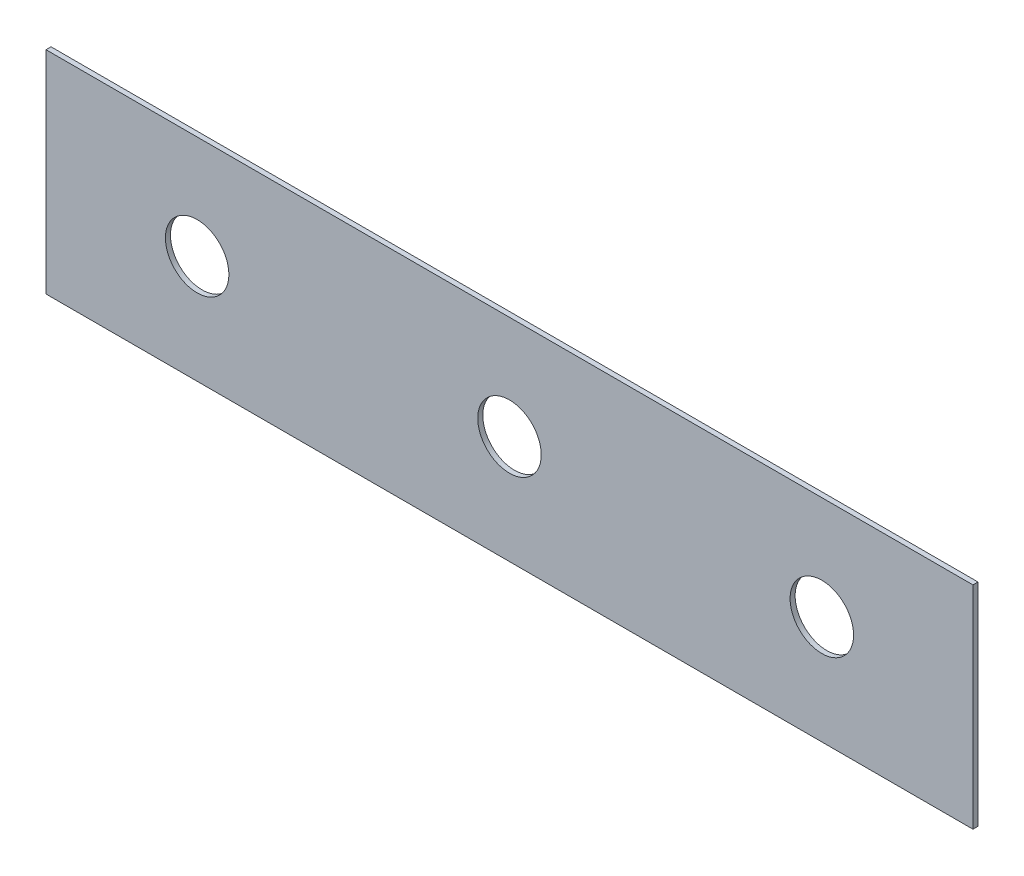
ISO-10303-21;
HEADER;
FILE_DESCRIPTION(('STEP AP214'),'2;1');
FILE_NAME('part.step','',(''),(''),'','','');
FILE_SCHEMA(('AUTOMOTIVE_DESIGN { 1 0 10303 214 1 1 1 1 }'));
ENDSEC;
DATA;
#1=APPLICATION_CONTEXT('core data for automotive mechanical design processes');
#2=APPLICATION_PROTOCOL_DEFINITION('international standard','automotive_design',2000,#1);
#3=PRODUCT_CONTEXT('',#1,'mechanical');
#4=PRODUCT('Part','Part','',(#3));
#5=PRODUCT_RELATED_PRODUCT_CATEGORY('part','',(#4));
#6=PRODUCT_DEFINITION_FORMATION('','',#4);
#7=PRODUCT_DEFINITION_CONTEXT('part definition',#1,'design');
#8=PRODUCT_DEFINITION('design','',#6,#7);
#9=PRODUCT_DEFINITION_SHAPE('','',#8);
#10=(LENGTH_UNIT() NAMED_UNIT(*) SI_UNIT(.MILLI.,.METRE.));
#11=(NAMED_UNIT(*) PLANE_ANGLE_UNIT() SI_UNIT($,.RADIAN.));
#12=(NAMED_UNIT(*) SI_UNIT($,.STERADIAN.) SOLID_ANGLE_UNIT());
#13=UNCERTAINTY_MEASURE_WITH_UNIT(LENGTH_MEASURE(1.E-05),#10,'distance_accuracy_value','');
#14=(GEOMETRIC_REPRESENTATION_CONTEXT(3) GLOBAL_UNCERTAINTY_ASSIGNED_CONTEXT((#13)) GLOBAL_UNIT_ASSIGNED_CONTEXT((#10,
#11,#12)) REPRESENTATION_CONTEXT('',''));
#15=CARTESIAN_POINT('',(0.,0.,0.));
#16=DIRECTION('',(0.,0.,1.));
#17=DIRECTION('',(1.,0.,0.));
#18=AXIS2_PLACEMENT_3D('',#15,#16,#17);
#19=CARTESIAN_POINT('',(0.,0.,1.));
#20=DIRECTION('',(0.,0.,1.));
#21=DIRECTION('',(1.,0.,0.));
#22=AXIS2_PLACEMENT_3D('',#19,#20,#21);
#23=PLANE('',#22);
#24=CARTESIAN_POINT('',(0.,28.5,1.));
#25=DIRECTION('',(0.,0.,1.));
#26=DIRECTION('',(1.,0.,0.));
#27=AXIS2_PLACEMENT_3D('',#24,#25,#26);
#28=CIRCLE('',#27,6.3);
#29=CARTESIAN_POINT('',(6.3,28.5,1.));
#30=VERTEX_POINT('',#29);
#31=EDGE_CURVE('E141',#30,#30,#28,.T.);
#32=ORIENTED_EDGE('',*,*,#31,.F.);
#33=EDGE_LOOP('',(#32));
#34=FACE_BOUND('',#33,.T.);
#35=DIRECTION('',(0.,-1.,0.));
#36=VECTOR('',#35,1.);
#37=CARTESIAN_POINT('',(-92.,49.,1.));
#38=LINE('',#37,#36);
#39=CARTESIAN_POINT('',(-92.,49.,1.));
#40=VERTEX_POINT('',#39);
#41=CARTESIAN_POINT('',(-92.,7.,1.));
#42=VERTEX_POINT('',#41);
#43=EDGE_CURVE('E98',#40,#42,#38,.T.);
#44=ORIENTED_EDGE('',*,*,#43,.T.);
#45=DIRECTION('',(1.,0.,0.));
#46=VECTOR('',#45,1.);
#47=CARTESIAN_POINT('',(-92.,7.,1.));
#48=LINE('',#47,#46);
#49=CARTESIAN_POINT('',(92.,7.,1.));
#50=VERTEX_POINT('',#49);
#51=EDGE_CURVE('E93',#42,#50,#48,.T.);
#52=ORIENTED_EDGE('',*,*,#51,.T.);
#53=DIRECTION('',(0.,1.,0.));
#54=VECTOR('',#53,1.);
#55=CARTESIAN_POINT('',(92.,7.,1.));
#56=LINE('',#55,#54);
#57=CARTESIAN_POINT('',(92.,49.,1.));
#58=VERTEX_POINT('',#57);
#59=EDGE_CURVE('E96',#50,#58,#56,.T.);
#60=ORIENTED_EDGE('',*,*,#59,.T.);
#61=DIRECTION('',(-1.,0.,0.));
#62=VECTOR('',#61,1.);
#63=CARTESIAN_POINT('',(92.,49.,1.));
#64=LINE('',#63,#62);
#65=EDGE_CURVE('E63',#58,#40,#64,.T.);
#66=ORIENTED_EDGE('',*,*,#65,.T.);
#67=EDGE_LOOP('',(#44,#52,#60,#66));
#68=FACE_BOUND('',#67,.T.);
#69=CARTESIAN_POINT('',(-62.,28.5,1.));
#70=DIRECTION('',(0.,0.,1.));
#71=DIRECTION('',(1.,0.,0.));
#72=AXIS2_PLACEMENT_3D('',#69,#70,#71);
#73=CIRCLE('',#72,6.3);
#74=CARTESIAN_POINT('',(-55.7,28.5,1.));
#75=VERTEX_POINT('',#74);
#76=EDGE_CURVE('E119',#75,#75,#73,.T.);
#77=ORIENTED_EDGE('',*,*,#76,.F.);
#78=EDGE_LOOP('',(#77));
#79=FACE_BOUND('',#78,.T.);
#80=CARTESIAN_POINT('',(62.,28.5,1.));
#81=DIRECTION('',(0.,0.,1.));
#82=DIRECTION('',(1.,0.,0.));
#83=AXIS2_PLACEMENT_3D('',#80,#81,#82);
#84=CIRCLE('',#83,6.3);
#85=CARTESIAN_POINT('',(68.3,28.5,1.));
#86=VERTEX_POINT('',#85);
#87=EDGE_CURVE('E149',#86,#86,#84,.T.);
#88=ORIENTED_EDGE('',*,*,#87,.F.);
#89=EDGE_LOOP('',(#88));
#90=FACE_BOUND('',#89,.T.);
#91=ADVANCED_FACE('F45',(#34,#68,#79,#90),#23,.T.);
#92=CARTESIAN_POINT('',(0.,0.,0.));
#93=DIRECTION('',(0.,0.,1.));
#94=DIRECTION('',(1.,0.,0.));
#95=AXIS2_PLACEMENT_3D('',#92,#93,#94);
#96=PLANE('',#95);
#97=DIRECTION('',(0.,-1.,0.));
#98=VECTOR('',#97,1.);
#99=CARTESIAN_POINT('',(-92.,49.,0.));
#100=LINE('',#99,#98);
#101=CARTESIAN_POINT('',(-92.,49.,0.));
#102=VERTEX_POINT('',#101);
#103=CARTESIAN_POINT('',(-92.,7.,0.));
#104=VERTEX_POINT('',#103);
#105=EDGE_CURVE('E115',#102,#104,#100,.T.);
#106=ORIENTED_EDGE('',*,*,#105,.F.);
#107=DIRECTION('',(-1.,0.,0.));
#108=VECTOR('',#107,1.);
#109=CARTESIAN_POINT('',(92.,49.,0.));
#110=LINE('',#109,#108);
#111=CARTESIAN_POINT('',(92.,49.,0.));
#112=VERTEX_POINT('',#111);
#113=EDGE_CURVE('E86',#112,#102,#110,.T.);
#114=ORIENTED_EDGE('',*,*,#113,.F.);
#115=DIRECTION('',(0.,1.,0.));
#116=VECTOR('',#115,1.);
#117=CARTESIAN_POINT('',(92.,7.,0.));
#118=LINE('',#117,#116);
#119=CARTESIAN_POINT('',(92.,7.,0.));
#120=VERTEX_POINT('',#119);
#121=EDGE_CURVE('E80',#120,#112,#118,.T.);
#122=ORIENTED_EDGE('',*,*,#121,.F.);
#123=DIRECTION('',(1.,0.,0.));
#124=VECTOR('',#123,1.);
#125=CARTESIAN_POINT('',(-92.,7.,0.));
#126=LINE('',#125,#124);
#127=EDGE_CURVE('E103',#104,#120,#126,.T.);
#128=ORIENTED_EDGE('',*,*,#127,.F.);
#129=EDGE_LOOP('',(#106,#114,#122,#128));
#130=FACE_BOUND('',#129,.T.);
#131=CARTESIAN_POINT('',(-62.,28.5,0.));
#132=DIRECTION('',(0.,0.,1.));
#133=DIRECTION('',(1.,0.,0.));
#134=AXIS2_PLACEMENT_3D('',#131,#132,#133);
#135=CIRCLE('',#134,6.3);
#136=CARTESIAN_POINT('',(-55.7,28.5,0.));
#137=VERTEX_POINT('',#136);
#138=EDGE_CURVE('E137',#137,#137,#135,.T.);
#139=ORIENTED_EDGE('',*,*,#138,.T.);
#140=EDGE_LOOP('',(#139));
#141=FACE_BOUND('',#140,.T.);
#142=CARTESIAN_POINT('',(0.,28.5,0.));
#143=DIRECTION('',(0.,0.,1.));
#144=DIRECTION('',(1.,0.,0.));
#145=AXIS2_PLACEMENT_3D('',#142,#143,#144);
#146=CIRCLE('',#145,6.3);
#147=CARTESIAN_POINT('',(6.3,28.5,0.));
#148=VERTEX_POINT('',#147);
#149=EDGE_CURVE('E145',#148,#148,#146,.T.);
#150=ORIENTED_EDGE('',*,*,#149,.T.);
#151=EDGE_LOOP('',(#150));
#152=FACE_BOUND('',#151,.T.);
#153=CARTESIAN_POINT('',(62.,28.5,0.));
#154=DIRECTION('',(0.,0.,1.));
#155=DIRECTION('',(1.,0.,0.));
#156=AXIS2_PLACEMENT_3D('',#153,#154,#155);
#157=CIRCLE('',#156,6.3);
#158=CARTESIAN_POINT('',(68.3,28.5,0.));
#159=VERTEX_POINT('',#158);
#160=EDGE_CURVE('E153',#159,#159,#157,.T.);
#161=ORIENTED_EDGE('',*,*,#160,.T.);
#162=EDGE_LOOP('',(#161));
#163=FACE_BOUND('',#162,.T.);
#164=ADVANCED_FACE('F132',(#130,#141,#152,#163),#96,.F.);
#165=CARTESIAN_POINT('',(-92.,49.,1.));
#166=DIRECTION('',(1.,0.,0.));
#167=DIRECTION('',(0.,0.,-1.));
#168=AXIS2_PLACEMENT_3D('',#165,#166,#167);
#169=PLANE('',#168);
#170=ORIENTED_EDGE('',*,*,#105,.T.);
#171=DIRECTION('',(0.,0.,-1.));
#172=VECTOR('',#171,1.);
#173=CARTESIAN_POINT('',(-92.,7.,1.));
#174=LINE('',#173,#172);
#175=EDGE_CURVE('E11',#42,#104,#174,.T.);
#176=ORIENTED_EDGE('',*,*,#175,.F.);
#177=ORIENTED_EDGE('',*,*,#43,.F.);
#178=DIRECTION('',(0.,0.,-1.));
#179=VECTOR('',#178,1.);
#180=CARTESIAN_POINT('',(-92.,49.,1.));
#181=LINE('',#180,#179);
#182=EDGE_CURVE('E111',#40,#102,#181,.T.);
#183=ORIENTED_EDGE('',*,*,#182,.T.);
#184=EDGE_LOOP('',(#170,#176,#177,#183));
#185=FACE_BOUND('',#184,.T.);
#186=ADVANCED_FACE('F47',(#185),#169,.F.);
#187=CARTESIAN_POINT('',(-92.,7.,1.));
#188=DIRECTION('',(0.,1.,0.));
#189=DIRECTION('',(0.,0.,1.));
#190=AXIS2_PLACEMENT_3D('',#187,#188,#189);
#191=PLANE('',#190);
#192=ORIENTED_EDGE('',*,*,#127,.T.);
#193=DIRECTION('',(0.,0.,-1.));
#194=VECTOR('',#193,1.);
#195=CARTESIAN_POINT('',(92.,7.,1.));
#196=LINE('',#195,#194);
#197=EDGE_CURVE('E55',#50,#120,#196,.T.);
#198=ORIENTED_EDGE('',*,*,#197,.F.);
#199=ORIENTED_EDGE('',*,*,#51,.F.);
#200=ORIENTED_EDGE('',*,*,#175,.T.);
#201=EDGE_LOOP('',(#192,#198,#199,#200));
#202=FACE_BOUND('',#201,.T.);
#203=ADVANCED_FACE('F102',(#202),#191,.F.);
#204=CARTESIAN_POINT('',(92.,7.,1.));
#205=DIRECTION('',(-1.,0.,0.));
#206=DIRECTION('',(0.,0.,1.));
#207=AXIS2_PLACEMENT_3D('',#204,#205,#206);
#208=PLANE('',#207);
#209=ORIENTED_EDGE('',*,*,#121,.T.);
#210=DIRECTION('',(0.,0.,-1.));
#211=VECTOR('',#210,1.);
#212=CARTESIAN_POINT('',(92.,49.,1.));
#213=LINE('',#212,#211);
#214=EDGE_CURVE('E105',#58,#112,#213,.T.);
#215=ORIENTED_EDGE('',*,*,#214,.F.);
#216=ORIENTED_EDGE('',*,*,#59,.F.);
#217=ORIENTED_EDGE('',*,*,#197,.T.);
#218=EDGE_LOOP('',(#209,#215,#216,#217));
#219=FACE_BOUND('',#218,.T.);
#220=ADVANCED_FACE('F106',(#219),#208,.F.);
#221=CARTESIAN_POINT('',(92.,49.,1.));
#222=DIRECTION('',(0.,-1.,0.));
#223=DIRECTION('',(0.,0.,-1.));
#224=AXIS2_PLACEMENT_3D('',#221,#222,#223);
#225=PLANE('',#224);
#226=ORIENTED_EDGE('',*,*,#113,.T.);
#227=ORIENTED_EDGE('',*,*,#182,.F.);
#228=ORIENTED_EDGE('',*,*,#65,.F.);
#229=ORIENTED_EDGE('',*,*,#214,.T.);
#230=EDGE_LOOP('',(#226,#227,#228,#229));
#231=FACE_BOUND('',#230,.T.);
#232=ADVANCED_FACE('F129',(#231),#225,.F.);
#233=CARTESIAN_POINT('',(-62.,28.5,1.));
#234=DIRECTION('',(0.,0.,-1.));
#235=DIRECTION('',(-1.,0.,0.));
#236=AXIS2_PLACEMENT_3D('',#233,#234,#235);
#237=CYLINDRICAL_SURFACE('',#236,6.3);
#238=ORIENTED_EDGE('',*,*,#76,.T.);
#239=EDGE_LOOP('',(#238));
#240=FACE_BOUND('',#239,.T.);
#241=ORIENTED_EDGE('',*,*,#138,.F.);
#242=EDGE_LOOP('',(#241));
#243=FACE_BOUND('',#242,.T.);
#244=ADVANCED_FACE('F171',(#240,#243),#237,.F.);
#245=CARTESIAN_POINT('',(0.,28.5,1.));
#246=DIRECTION('',(0.,0.,-1.));
#247=DIRECTION('',(-1.,0.,0.));
#248=AXIS2_PLACEMENT_3D('',#245,#246,#247);
#249=CYLINDRICAL_SURFACE('',#248,6.3);
#250=ORIENTED_EDGE('',*,*,#31,.T.);
#251=EDGE_LOOP('',(#250));
#252=FACE_BOUND('',#251,.T.);
#253=ORIENTED_EDGE('',*,*,#149,.F.);
#254=EDGE_LOOP('',(#253));
#255=FACE_BOUND('',#254,.T.);
#256=ADVANCED_FACE('F222',(#252,#255),#249,.F.);
#257=CARTESIAN_POINT('',(62.,28.5,1.));
#258=DIRECTION('',(0.,0.,-1.));
#259=DIRECTION('',(-1.,0.,0.));
#260=AXIS2_PLACEMENT_3D('',#257,#258,#259);
#261=CYLINDRICAL_SURFACE('',#260,6.3);
#262=ORIENTED_EDGE('',*,*,#87,.T.);
#263=EDGE_LOOP('',(#262));
#264=FACE_BOUND('',#263,.T.);
#265=ORIENTED_EDGE('',*,*,#160,.F.);
#266=EDGE_LOOP('',(#265));
#267=FACE_BOUND('',#266,.T.);
#268=ADVANCED_FACE('F160',(#264,#267),#261,.F.);
#269=CLOSED_SHELL('',(#91,#164,#186,#203,#220,#232,#244,#256,#268));
#270=MANIFOLD_SOLID_BREP('B2',#269);
#271=ADVANCED_BREP_SHAPE_REPRESENTATION('',(#18,#270),#14);
#272=SHAPE_DEFINITION_REPRESENTATION(#9,#271);
ENDSEC;
END-ISO-10303-21;
